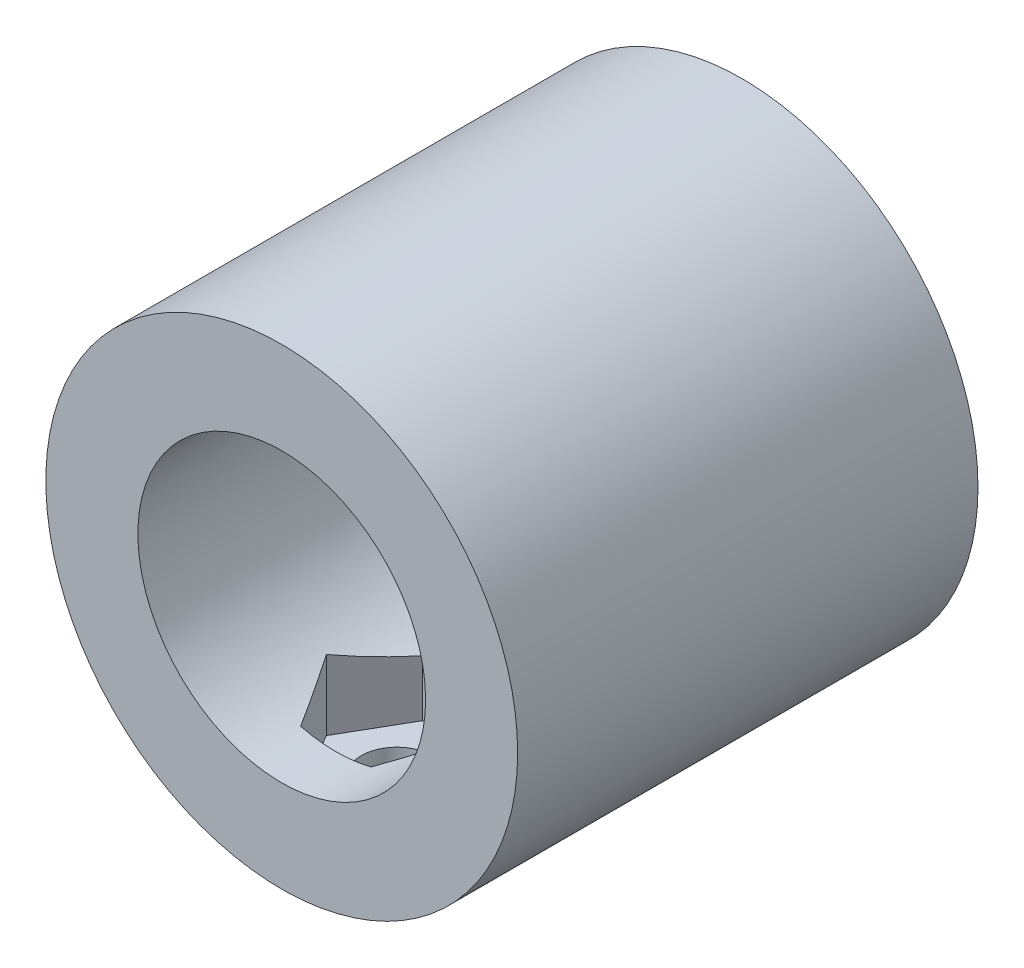
ISO-10303-21;
HEADER;
FILE_DESCRIPTION(('STEP AP214'),'2;1');
FILE_NAME('part.step','',(''),(''),'','','');
FILE_SCHEMA(('AUTOMOTIVE_DESIGN { 1 0 10303 214 1 1 1 1 }'));
ENDSEC;
DATA;
#1=APPLICATION_CONTEXT('core data for automotive mechanical design processes');
#2=APPLICATION_PROTOCOL_DEFINITION('international standard','automotive_design',2000,#1);
#3=PRODUCT_CONTEXT('',#1,'mechanical');
#4=PRODUCT('Part','Part','',(#3));
#5=PRODUCT_RELATED_PRODUCT_CATEGORY('part','',(#4));
#6=PRODUCT_DEFINITION_FORMATION('','',#4);
#7=PRODUCT_DEFINITION_CONTEXT('part definition',#1,'design');
#8=PRODUCT_DEFINITION('design','',#6,#7);
#9=PRODUCT_DEFINITION_SHAPE('','',#8);
#10=(LENGTH_UNIT() NAMED_UNIT(*) SI_UNIT(.MILLI.,.METRE.));
#11=(NAMED_UNIT(*) PLANE_ANGLE_UNIT() SI_UNIT($,.RADIAN.));
#12=(NAMED_UNIT(*) SI_UNIT($,.STERADIAN.) SOLID_ANGLE_UNIT());
#13=UNCERTAINTY_MEASURE_WITH_UNIT(LENGTH_MEASURE(1.E-05),#10,'distance_accuracy_value','');
#14=(GEOMETRIC_REPRESENTATION_CONTEXT(3) GLOBAL_UNCERTAINTY_ASSIGNED_CONTEXT((#13)) GLOBAL_UNIT_ASSIGNED_CONTEXT((#10,
#11,#12)) REPRESENTATION_CONTEXT('',''));
#15=CARTESIAN_POINT('',(0.,0.,0.));
#16=DIRECTION('',(0.,0.,1.));
#17=DIRECTION('',(1.,0.,0.));
#18=AXIS2_PLACEMENT_3D('',#15,#16,#17);
#19=CARTESIAN_POINT('',(0.,0.,-10.));
#20=DIRECTION('',(0.,0.,1.));
#21=DIRECTION('',(1.,0.,0.));
#22=AXIS2_PLACEMENT_3D('',#19,#20,#21);
#23=CYLINDRICAL_SURFACE('',#22,10.25);
#24=CARTESIAN_POINT('',(0.,-10.25,-3.45));
#25=CARTESIAN_POINT('',(-0.0865348321088135,-10.2499986053705,-3.45000356217303));
#26=CARTESIAN_POINT('',(-0.173119668117051,-10.2488926749848,-3.45727118533907));
#27=CARTESIAN_POINT('',(-0.343868589294295,-10.2445873413368,-3.48614196608053));
#28=CARTESIAN_POINT('',(-0.428030243864392,-10.2413859076363,-3.50775902783456));
#29=CARTESIAN_POINT('',(-0.591437063532486,-10.2332492883849,-3.56466750308635));
#30=CARTESIAN_POINT('',(-0.670685913026276,-10.2283154210548,-3.59994852167929));
#31=CARTESIAN_POINT('',(-0.822126594947794,-10.2172589365896,-3.68315788164029));
#32=CARTESIAN_POINT('',(-0.894319393482853,-10.2111364825382,-3.73108448825352));
#33=CARTESIAN_POINT('',(-1.03018345274116,-10.1983291923282,-3.83862969248016));
#34=CARTESIAN_POINT('',(-1.09379061702723,-10.1916406741666,-3.89832883451123));
#35=CARTESIAN_POINT('',(-1.21012477662503,-10.1784838680654,-4.02755114510604));
#36=CARTESIAN_POINT('',(-1.26285114202978,-10.1720155928941,-4.09707488203908));
#37=CARTESIAN_POINT('',(-1.35617702330486,-10.1599959063989,-4.24440419530083));
#38=CARTESIAN_POINT('',(-1.39671442797166,-10.1544492534188,-4.32224953792157));
#39=CARTESIAN_POINT('',(-1.46411473309154,-10.1449511446445,-4.48374187277448));
#40=CARTESIAN_POINT('',(-1.49097839113477,-10.1409996004761,-4.56738854329384));
#41=CARTESIAN_POINT('',(-1.53006937962636,-10.1351753427462,-4.73743463638538));
#42=CARTESIAN_POINT('',(-1.54240650911907,-10.1332870420529,-4.82380827419157));
#43=CARTESIAN_POINT('',(-1.55243440168558,-10.1317557596738,-4.99741886179157));
#44=CARTESIAN_POINT('',(-1.55012601926012,-10.1321126469912,-5.0846557609214));
#45=CARTESIAN_POINT('',(-1.5310181238825,-10.1350171653338,-5.25674033130877));
#46=CARTESIAN_POINT('',(-1.51434097371829,-10.1375462972047,-5.34160194670944));
#47=CARTESIAN_POINT('',(-1.46716052625552,-10.1444814322318,-5.50730841704655));
#48=CARTESIAN_POINT('',(-1.43665683198903,-10.1488874892753,-5.58815315658224));
#49=CARTESIAN_POINT('',(-1.36256214307549,-10.1591004242303,-5.74390286737503));
#50=CARTESIAN_POINT('',(-1.31891939003739,-10.1649128240033,-5.81878283873189));
#51=CARTESIAN_POINT('',(-1.2198222944323,-10.1772795520351,-5.96020301272271));
#52=CARTESIAN_POINT('',(-1.16436716418293,-10.1838339297576,-6.02674265873019));
#53=CARTESIAN_POINT('',(-1.04254816148594,-10.1970278025317,-6.15030247247038));
#54=CARTESIAN_POINT('',(-0.976079100793151,-10.2036674854031,-6.20721896499593));
#55=CARTESIAN_POINT('',(-0.834477366796303,-10.2162219677859,-6.30910479749397));
#56=CARTESIAN_POINT('',(-0.759344654427407,-10.2221367640285,-6.35407408359291));
#57=CARTESIAN_POINT('',(-0.60245796212873,-10.23258136228,-6.43079460909469));
#58=CARTESIAN_POINT('',(-0.52069997098957,-10.2371103172003,-6.46253776836357));
#59=CARTESIAN_POINT('',(-0.352929878355662,-10.2442658789525,-6.5118144109354));
#60=CARTESIAN_POINT('',(-0.26691806963106,-10.2468926165108,-6.52934887071587));
#61=CARTESIAN_POINT('',(-0.0939766088141966,-10.2499304485547,-6.54957232768525));
#62=CARTESIAN_POINT('',(-0.00706398241373882,-10.2503628125253,-6.55240384287632));
#63=CARTESIAN_POINT('',(0.165994899168943,-10.2490211041617,-6.5435194384284));
#64=CARTESIAN_POINT('',(0.252141178389057,-10.2472471012816,-6.5318039767141));
#65=CARTESIAN_POINT('',(0.420789704617876,-10.2417051449883,-6.49427668964021));
#66=CARTESIAN_POINT('',(0.503307770287664,-10.2379470270023,-6.46853437655401));
#67=CARTESIAN_POINT('',(0.662856674334904,-10.2288568390174,-6.40375747633752));
#68=CARTESIAN_POINT('',(0.739887251177548,-10.2235246940623,-6.36472225617644));
#69=CARTESIAN_POINT('',(0.886900712724522,-10.2118260815247,-6.27413380757472));
#70=CARTESIAN_POINT('',(0.956827354853739,-10.2054522669457,-6.22249027093183));
#71=CARTESIAN_POINT('',(1.08707208504692,-10.1924024017133,-6.10827678728586));
#72=CARTESIAN_POINT('',(1.14738960466405,-10.1857263332094,-6.0457061943296));
#73=CARTESIAN_POINT('',(1.25722314870822,-10.172756858438,-5.91077994903495));
#74=CARTESIAN_POINT('',(1.30664358383511,-10.166467162767,-5.8383460733735));
#75=CARTESIAN_POINT('',(1.3926154419135,-10.1550485464386,-5.68612128014781));
#76=CARTESIAN_POINT('',(1.42916721700988,-10.1499195940195,-5.6063305639755));
#77=CARTESIAN_POINT('',(1.48821639543038,-10.1414301103392,-5.44194085143561));
#78=CARTESIAN_POINT('',(1.51076391124777,-10.1380632804302,-5.35736019524326));
#79=CARTESIAN_POINT('',(1.54132390134593,-10.1334625625274,-5.18555783206999));
#80=CARTESIAN_POINT('',(1.549337397238,-10.1322285246179,-5.09833631115639));
#81=CARTESIAN_POINT('',(1.55057727658034,-10.1320387711031,-4.92468100595166));
#82=CARTESIAN_POINT('',(1.54395396996473,-10.1330598964486,-4.83824828268147));
#83=CARTESIAN_POINT('',(1.51643056540358,-10.1372150525975,-4.66774109427393));
#84=CARTESIAN_POINT('',(1.49553049184221,-10.1403490797922,-4.58366662510903));
#85=CARTESIAN_POINT('',(1.44010029519621,-10.1483687676275,-4.42030532027696));
#86=CARTESIAN_POINT('',(1.4055808489965,-10.1532530558792,-4.34101479025187));
#87=CARTESIAN_POINT('',(1.32390677752962,-10.1642245756178,-4.18932630486426));
#88=CARTESIAN_POINT('',(1.27675171036037,-10.1703118491745,-4.11692859068231));
#89=CARTESIAN_POINT('',(1.17059953896318,-10.1830778433865,-3.98031746522321));
#90=CARTESIAN_POINT('',(1.11149116104393,-10.18976176481,-3.91619099379086));
#91=CARTESIAN_POINT('',(0.983345389707575,-10.2029246649288,-3.79871386033702));
#92=CARTESIAN_POINT('',(0.914305692970891,-10.2094035956554,-3.74536570499539));
#93=CARTESIAN_POINT('',(0.76780194758175,-10.2214679961972,-3.65069225533131));
#94=CARTESIAN_POINT('',(0.690292896422896,-10.2270482605605,-3.6094359475474));
#95=CARTESIAN_POINT('',(0.529397254428289,-10.2366355718388,-3.54058932264131));
#96=CARTESIAN_POINT('',(0.446016836955974,-10.2406442428873,-3.51298488948904));
#97=CARTESIAN_POINT('',(0.301888233137365,-10.2457244681152,-3.47846909601471));
#98=CARTESIAN_POINT('',(0.242028502484471,-10.2473195347582,-3.46780955522207));
#99=CARTESIAN_POINT('',(0.121454052471653,-10.2494577834537,-3.45357380215324));
#100=CARTESIAN_POINT('',(0.0607393440078185,-10.2500009788992,-3.4499974996883));
#101=CARTESIAN_POINT('',(0.,-10.25,-3.45));
#102=B_SPLINE_CURVE_WITH_KNOTS('',3,(#24,#25,#26,#27,#28,#29,#30,#31,#32,#33,#34,#35,#36,#37,
#38,#39,#40,#41,#42,#43,#44,#45,#46,#47,#48,#49,#50,#51,#52,#53,#54,#55,#56,#57,#58,#59,#60,#61,
#62,#63,#64,#65,#66,#67,#68,#69,#70,#71,#72,#73,#74,#75,#76,#77,#78,#79,#80,#81,#82,#83,#84,#85,
#86,#87,#88,#89,#90,#91,#92,#93,#94,#95,#96,#97,#98,#99,#100,#101),.UNSPECIFIED.,.T.,.F.,(4,2,2,
2,2,2,2,2,2,2,2,2,2,2,2,2,2,2,2,2,2,2,2,2,2,2,2,2,2,2,2,2,2,2,2,2,2,2,4),(0.,0.259382543158152,
0.519016787871818,0.778453901650569,1.03785544365511,1.29909749425536,1.56035466433869,
1.82292139862237,2.08547358388471,2.34602825777858,2.6065677296013,2.86491016310354,
3.12326001423347,3.38264119790388,3.64203968325554,3.90407577382953,4.16611304598345,
4.42831016862053,4.69048927051505,4.95012221963153,5.20974699596226,5.46809670972895,
5.72645872826801,5.98672856906625,6.2470138009339,6.50949865976874,6.77197633526961,
7.03350927259408,7.29502382578523,7.55386529533026,7.81270632278487,8.07134483415255,
8.32999239199401,8.59116878573633,8.85240585072738,9.11510554352298,9.37753303409524,
9.55959759397974,9.74165983567561),.UNSPECIFIED.);
#103=CARTESIAN_POINT('',(0.,-10.25,-3.45));
#104=VERTEX_POINT('',#103);
#105=EDGE_CURVE('E152',#104,#104,#102,.T.);
#106=ORIENTED_EDGE('',*,*,#105,.F.);
#107=EDGE_LOOP('',(#106));
#108=FACE_BOUND('',#107,.T.);
#109=CARTESIAN_POINT('',(0.,-10.25,6.55));
#110=CARTESIAN_POINT('',(-0.0865348321088134,-10.2499986053705,6.54999643782697));
#111=CARTESIAN_POINT('',(-0.17311966811705,-10.2488926749848,6.54272881466093));
#112=CARTESIAN_POINT('',(-0.343868589294295,-10.2445873413368,6.51385803391947));
#113=CARTESIAN_POINT('',(-0.428030243864392,-10.2413859076363,6.49224097216544));
#114=CARTESIAN_POINT('',(-0.591437063532485,-10.2332492883849,6.43533249691365));
#115=CARTESIAN_POINT('',(-0.670685913026275,-10.2283154210548,6.40005147832071));
#116=CARTESIAN_POINT('',(-0.822126594947793,-10.2172589365896,6.31684211835971));
#117=CARTESIAN_POINT('',(-0.894319393482852,-10.2111364825382,6.26891551174648));
#118=CARTESIAN_POINT('',(-1.03018345274116,-10.1983291923282,6.16137030751984));
#119=CARTESIAN_POINT('',(-1.09379061702723,-10.1916406741666,6.10167116548877));
#120=CARTESIAN_POINT('',(-1.21012477662503,-10.1784838680654,5.97244885489396));
#121=CARTESIAN_POINT('',(-1.26285114202978,-10.1720155928941,5.90292511796092));
#122=CARTESIAN_POINT('',(-1.35617702330486,-10.1599959063989,5.75559580469918));
#123=CARTESIAN_POINT('',(-1.39671442797166,-10.1544492534188,5.67775046207843));
#124=CARTESIAN_POINT('',(-1.46411473309154,-10.1449511446445,5.51625812722552));
#125=CARTESIAN_POINT('',(-1.49097839113477,-10.1409996004761,5.43261145670616));
#126=CARTESIAN_POINT('',(-1.53006937962636,-10.1351753427462,5.26256536361462));
#127=CARTESIAN_POINT('',(-1.54240650911907,-10.1332870420529,5.17619172580843));
#128=CARTESIAN_POINT('',(-1.55243440168558,-10.1317557596738,5.00258113820843));
#129=CARTESIAN_POINT('',(-1.55012601926012,-10.1321126469912,4.9153442390786));
#130=CARTESIAN_POINT('',(-1.5310181238825,-10.1350171653338,4.74325966869123));
#131=CARTESIAN_POINT('',(-1.51434097371829,-10.1375462972047,4.65839805329056));
#132=CARTESIAN_POINT('',(-1.46716052625552,-10.1444814322318,4.49269158295345));
#133=CARTESIAN_POINT('',(-1.43665683198903,-10.1488874892753,4.41184684341776));
#134=CARTESIAN_POINT('',(-1.36256214307549,-10.1591004242303,4.25609713262497));
#135=CARTESIAN_POINT('',(-1.31891939003739,-10.1649128240033,4.18121716126811));
#136=CARTESIAN_POINT('',(-1.2198222944323,-10.1772795520351,4.03979698727729));
#137=CARTESIAN_POINT('',(-1.16436716418293,-10.1838339297576,3.97325734126981));
#138=CARTESIAN_POINT('',(-1.04254816148594,-10.1970278025317,3.84969752752962));
#139=CARTESIAN_POINT('',(-0.976079100793151,-10.2036674854031,3.79278103500408));
#140=CARTESIAN_POINT('',(-0.834477366796303,-10.2162219677859,3.69089520250603));
#141=CARTESIAN_POINT('',(-0.759344654427407,-10.2221367640285,3.64592591640709));
#142=CARTESIAN_POINT('',(-0.60245796212873,-10.23258136228,3.56920539090531));
#143=CARTESIAN_POINT('',(-0.52069997098957,-10.2371103172003,3.53746223163643));
#144=CARTESIAN_POINT('',(-0.352929878355663,-10.2442658789525,3.4881855890646));
#145=CARTESIAN_POINT('',(-0.266918069631061,-10.2468926165108,3.47065112928413));
#146=CARTESIAN_POINT('',(-0.0939766088141973,-10.2499304485547,3.45042767231475));
#147=CARTESIAN_POINT('',(-0.00706398241373914,-10.2503628125253,3.44759615712368));
#148=CARTESIAN_POINT('',(0.165994899168943,-10.2490211041617,3.4564805615716));
#149=CARTESIAN_POINT('',(0.252141178389056,-10.2472471012816,3.4681960232859));
#150=CARTESIAN_POINT('',(0.420789704617876,-10.2417051449883,3.50572331035979));
#151=CARTESIAN_POINT('',(0.503307770287664,-10.2379470270023,3.53146562344599));
#152=CARTESIAN_POINT('',(0.662856674334904,-10.2288568390174,3.59624252366248));
#153=CARTESIAN_POINT('',(0.739887251177547,-10.2235246940623,3.63527774382356));
#154=CARTESIAN_POINT('',(0.886900712724522,-10.2118260815247,3.72586619242528));
#155=CARTESIAN_POINT('',(0.956827354853738,-10.2054522669457,3.77750972906817));
#156=CARTESIAN_POINT('',(1.08707208504692,-10.1924024017133,3.89172321271414));
#157=CARTESIAN_POINT('',(1.14738960466405,-10.1857263332094,3.9542938056704));
#158=CARTESIAN_POINT('',(1.25722314870822,-10.172756858438,4.08922005096504));
#159=CARTESIAN_POINT('',(1.30664358383511,-10.166467162767,4.1616539266265));
#160=CARTESIAN_POINT('',(1.3926154419135,-10.1550485464386,4.31387871985219));
#161=CARTESIAN_POINT('',(1.42916721700988,-10.1499195940195,4.3936694360245));
#162=CARTESIAN_POINT('',(1.48821639543038,-10.1414301103392,4.55805914856439));
#163=CARTESIAN_POINT('',(1.51076391124777,-10.1380632804302,4.64263980475674));
#164=CARTESIAN_POINT('',(1.54132390134593,-10.1334625625274,4.81444216793001));
#165=CARTESIAN_POINT('',(1.549337397238,-10.1322285246179,4.90166368884361));
#166=CARTESIAN_POINT('',(1.55057727658034,-10.1320387711031,5.07531899404834));
#167=CARTESIAN_POINT('',(1.54395396996473,-10.1330598964486,5.16175171731853));
#168=CARTESIAN_POINT('',(1.51643056540358,-10.1372150525975,5.33225890572607));
#169=CARTESIAN_POINT('',(1.49553049184221,-10.1403490797922,5.41633337489097));
#170=CARTESIAN_POINT('',(1.44010029519621,-10.1483687676275,5.57969467972304));
#171=CARTESIAN_POINT('',(1.4055808489965,-10.1532530558792,5.65898520974813));
#172=CARTESIAN_POINT('',(1.32390677752962,-10.1642245756178,5.81067369513574));
#173=CARTESIAN_POINT('',(1.27675171036037,-10.1703118491745,5.88307140931769));
#174=CARTESIAN_POINT('',(1.17059953896318,-10.1830778433865,6.01968253477679));
#175=CARTESIAN_POINT('',(1.11149116104394,-10.18976176481,6.08380900620914));
#176=CARTESIAN_POINT('',(0.983345389707577,-10.2029246649288,6.20128613966298));
#177=CARTESIAN_POINT('',(0.914305692970891,-10.2094035956554,6.2546342950046));
#178=CARTESIAN_POINT('',(0.767801947581751,-10.2214679961972,6.34930774466869));
#179=CARTESIAN_POINT('',(0.690292896422897,-10.2270482605605,6.3905640524526));
#180=CARTESIAN_POINT('',(0.529397254428291,-10.2366355718388,6.45941067735869));
#181=CARTESIAN_POINT('',(0.446016836955975,-10.2406442428873,6.48701511051095));
#182=CARTESIAN_POINT('',(0.301888233137366,-10.2457244681152,6.52153090398529));
#183=CARTESIAN_POINT('',(0.242028502484471,-10.2473195347582,6.53219044477793));
#184=CARTESIAN_POINT('',(0.121454052471652,-10.2494577834537,6.54642619784676));
#185=CARTESIAN_POINT('',(0.0607393440078182,-10.2500009788992,6.5500025003117));
#186=CARTESIAN_POINT('',(0.,-10.25,6.55));
#187=B_SPLINE_CURVE_WITH_KNOTS('',3,(#109,#110,#111,#112,#113,#114,#115,#116,#117,#118,#119,
#120,#121,#122,#123,#124,#125,#126,#127,#128,#129,#130,#131,#132,#133,#134,#135,#136,#137,#138,
#139,#140,#141,#142,#143,#144,#145,#146,#147,#148,#149,#150,#151,#152,#153,#154,#155,#156,#157,
#158,#159,#160,#161,#162,#163,#164,#165,#166,#167,#168,#169,#170,#171,#172,#173,#174,#175,#176,
#177,#178,#179,#180,#181,#182,#183,#184,#185,#186),.UNSPECIFIED.,.T.,.F.,(4,2,2,2,2,2,2,2,2,2,2,
2,2,2,2,2,2,2,2,2,2,2,2,2,2,2,2,2,2,2,2,2,2,2,2,2,2,2,4),(0.,0.259382543158152,
0.519016787871818,0.778453901650568,1.03785544365511,1.29909749425536,1.56035466433869,
1.82292139862237,2.08547358388471,2.34602825777858,2.6065677296013,2.86491016310354,
3.12326001423347,3.38264119790388,3.64203968325554,3.90407577382953,4.16611304598345,
4.42831016862053,4.69048927051505,4.95012221963153,5.20974699596226,5.46809670972895,
5.72645872826801,5.98672856906625,6.2470138009339,6.50949865976874,6.77197633526961,
7.03350927259408,7.29502382578523,7.55386529533026,7.81270632278487,8.07134483415255,
8.32999239199401,8.59116878573632,8.85240585072738,9.11510554352298,9.37753303409524,
9.55959759397974,9.7416598356756),.UNSPECIFIED.);
#188=CARTESIAN_POINT('',(0.,-10.25,6.55));
#189=VERTEX_POINT('',#188);
#190=EDGE_CURVE('E283',#189,#189,#187,.T.);
#191=ORIENTED_EDGE('',*,*,#190,.F.);
#192=EDGE_LOOP('',(#191));
#193=FACE_BOUND('',#192,.T.);
#194=CARTESIAN_POINT('',(0.,0.,-10.));
#195=DIRECTION('',(0.,0.,1.));
#196=DIRECTION('',(1.,0.,0.));
#197=AXIS2_PLACEMENT_3D('',#194,#195,#196);
#198=CIRCLE('',#197,10.25);
#199=CARTESIAN_POINT('',(10.25,0.,-10.));
#200=VERTEX_POINT('',#199);
#201=EDGE_CURVE('E217',#200,#200,#198,.T.);
#202=ORIENTED_EDGE('',*,*,#201,.T.);
#203=EDGE_LOOP('',(#202));
#204=FACE_BOUND('',#203,.T.);
#205=CARTESIAN_POINT('',(0.,0.,10.));
#206=DIRECTION('',(0.,0.,1.));
#207=DIRECTION('',(1.,0.,0.));
#208=AXIS2_PLACEMENT_3D('',#205,#206,#207);
#209=CIRCLE('',#208,10.25);
#210=CARTESIAN_POINT('',(10.25,0.,10.));
#211=VERTEX_POINT('',#210);
#212=EDGE_CURVE('E211',#211,#211,#209,.T.);
#213=ORIENTED_EDGE('',*,*,#212,.F.);
#214=EDGE_LOOP('',(#213));
#215=FACE_BOUND('',#214,.T.);
#216=ADVANCED_FACE('F37',(#108,#193,#204,#215),#23,.T.);
#217=CARTESIAN_POINT('',(0.,0.,-10.));
#218=DIRECTION('',(0.,0.,1.));
#219=DIRECTION('',(1.,0.,0.));
#220=AXIS2_PLACEMENT_3D('',#217,#218,#219);
#221=PLANE('',#220);
#222=CARTESIAN_POINT('',(0.,0.,-10.));
#223=DIRECTION('',(0.,0.,1.));
#224=DIRECTION('',(1.,0.,0.));
#225=AXIS2_PLACEMENT_3D('',#222,#223,#224);
#226=CIRCLE('',#225,6.25);
#227=CARTESIAN_POINT('',(6.25,0.,-10.));
#228=VERTEX_POINT('',#227);
#229=EDGE_CURVE('E214',#228,#228,#226,.T.);
#230=ORIENTED_EDGE('',*,*,#229,.T.);
#231=EDGE_LOOP('',(#230));
#232=FACE_BOUND('',#231,.T.);
#233=ORIENTED_EDGE('',*,*,#201,.F.);
#234=EDGE_LOOP('',(#233));
#235=FACE_BOUND('',#234,.T.);
#236=ADVANCED_FACE('F271',(#232,#235),#221,.F.);
#237=CARTESIAN_POINT('',(0.,0.,-10.));
#238=DIRECTION('',(0.,0.,1.));
#239=DIRECTION('',(1.,0.,0.));
#240=AXIS2_PLACEMENT_3D('',#237,#238,#239);
#241=CYLINDRICAL_SURFACE('',#240,6.25);
#242=CARTESIAN_POINT('',(0.,0.,2.35));
#243=DIRECTION('',(0.,0.,-1.));
#244=DIRECTION('',(-1.,0.,0.));
#245=AXIS2_PLACEMENT_3D('',#242,#243,#244);
#246=CIRCLE('',#245,6.25);
#247=CARTESIAN_POINT('',(-1.52997821335251,-6.0598404819489,2.35));
#248=VERTEX_POINT('',#247);
#249=CARTESIAN_POINT('',(1.52997821335251,-6.0598404819489,2.35));
#250=VERTEX_POINT('',#249);
#251=EDGE_CURVE('E238',#248,#250,#246,.F.);
#252=ORIENTED_EDGE('',*,*,#251,.T.);
#253=CARTESIAN_POINT('',(0.,0.,-0.300000000000003));
#254=DIRECTION('',(0.866025403784439,0.,-0.5));
#255=DIRECTION('',(0.5,0.,0.866025403784439));
#256=AXIS2_PLACEMENT_3D('',#253,#254,#255);
#257=ELLIPSE('',#256,12.5,6.25);
#258=CARTESIAN_POINT('',(3.05995642670502,-5.44969418102215,5.));
#259=VERTEX_POINT('',#258);
#260=EDGE_CURVE('E11',#250,#259,#257,.F.);
#261=ORIENTED_EDGE('',*,*,#260,.T.);
#262=CARTESIAN_POINT('',(0.,0.,10.3));
#263=DIRECTION('',(0.866025403784439,0.,0.5));
#264=DIRECTION('',(-0.5,0.,0.866025403784439));
#265=AXIS2_PLACEMENT_3D('',#262,#263,#264);
#266=ELLIPSE('',#265,12.5,6.25);
#267=CARTESIAN_POINT('',(1.52997821335251,-6.0598404819489,7.65));
#268=VERTEX_POINT('',#267);
#269=EDGE_CURVE('E45',#259,#268,#266,.F.);
#270=ORIENTED_EDGE('',*,*,#269,.T.);
#271=CARTESIAN_POINT('',(0.,0.,7.65));
#272=DIRECTION('',(0.,0.,1.));
#273=DIRECTION('',(1.,0.,0.));
#274=AXIS2_PLACEMENT_3D('',#271,#272,#273);
#275=CIRCLE('',#274,6.25);
#276=CARTESIAN_POINT('',(-1.52997821335251,-6.0598404819489,7.65));
#277=VERTEX_POINT('',#276);
#278=EDGE_CURVE('E246',#268,#277,#275,.F.);
#279=ORIENTED_EDGE('',*,*,#278,.T.);
#280=CARTESIAN_POINT('',(0.,0.,10.3));
#281=DIRECTION('',(-0.866025403784439,0.,0.5));
#282=DIRECTION('',(0.5,0.,0.866025403784439));
#283=AXIS2_PLACEMENT_3D('',#280,#281,#282);
#284=ELLIPSE('',#283,12.5,6.25);
#285=CARTESIAN_POINT('',(-3.05995642670502,-5.44969418102215,5.));
#286=VERTEX_POINT('',#285);
#287=EDGE_CURVE('E243',#277,#286,#284,.F.);
#288=ORIENTED_EDGE('',*,*,#287,.T.);
#289=CARTESIAN_POINT('',(0.,0.,-0.300000000000007));
#290=DIRECTION('',(-0.866025403784439,0.,-0.5));
#291=DIRECTION('',(-0.5,0.,0.866025403784439));
#292=AXIS2_PLACEMENT_3D('',#289,#290,#291);
#293=ELLIPSE('',#292,12.5,6.25);
#294=EDGE_CURVE('E240',#286,#248,#293,.F.);
#295=ORIENTED_EDGE('',*,*,#294,.T.);
#296=EDGE_LOOP('',(#252,#261,#270,#279,#288,#295));
#297=FACE_BOUND('',#296,.T.);
#298=CARTESIAN_POINT('',(0.,0.,-7.65));
#299=DIRECTION('',(0.,0.,-1.));
#300=DIRECTION('',(-1.,0.,0.));
#301=AXIS2_PLACEMENT_3D('',#298,#299,#300);
#302=CIRCLE('',#301,6.25);
#303=CARTESIAN_POINT('',(-1.52997821335251,-6.0598404819489,-7.65));
#304=VERTEX_POINT('',#303);
#305=CARTESIAN_POINT('',(1.52997821335251,-6.0598404819489,-7.65));
#306=VERTEX_POINT('',#305);
#307=EDGE_CURVE('E220',#304,#306,#302,.F.);
#308=ORIENTED_EDGE('',*,*,#307,.T.);
#309=CARTESIAN_POINT('',(0.,0.,-10.3));
#310=DIRECTION('',(0.866025403784439,0.,-0.5));
#311=DIRECTION('',(0.5,0.,0.866025403784439));
#312=AXIS2_PLACEMENT_3D('',#309,#310,#311);
#313=ELLIPSE('',#312,12.5,6.25);
#314=CARTESIAN_POINT('',(3.05995642670502,-5.44969418102215,-5.));
#315=VERTEX_POINT('',#314);
#316=EDGE_CURVE('E235',#306,#315,#313,.F.);
#317=ORIENTED_EDGE('',*,*,#316,.T.);
#318=CARTESIAN_POINT('',(0.,0.,0.300000000000003));
#319=DIRECTION('',(0.866025403784439,0.,0.5));
#320=DIRECTION('',(-0.5,0.,0.866025403784439));
#321=AXIS2_PLACEMENT_3D('',#318,#319,#320);
#322=ELLIPSE('',#321,12.5,6.25);
#323=CARTESIAN_POINT('',(1.52997821335251,-6.0598404819489,-2.35));
#324=VERTEX_POINT('',#323);
#325=EDGE_CURVE('E232',#315,#324,#322,.F.);
#326=ORIENTED_EDGE('',*,*,#325,.T.);
#327=CARTESIAN_POINT('',(0.,0.,-2.35));
#328=DIRECTION('',(0.,0.,1.));
#329=DIRECTION('',(1.,0.,0.));
#330=AXIS2_PLACEMENT_3D('',#327,#328,#329);
#331=CIRCLE('',#330,6.25);
#332=CARTESIAN_POINT('',(-1.52997821335251,-6.0598404819489,-2.35));
#333=VERTEX_POINT('',#332);
#334=EDGE_CURVE('E229',#324,#333,#331,.F.);
#335=ORIENTED_EDGE('',*,*,#334,.T.);
#336=CARTESIAN_POINT('',(0.,0.,0.300000000000007));
#337=DIRECTION('',(-0.866025403784439,0.,0.5));
#338=DIRECTION('',(0.5,0.,0.866025403784439));
#339=AXIS2_PLACEMENT_3D('',#336,#337,#338);
#340=ELLIPSE('',#339,12.5,6.25);
#341=CARTESIAN_POINT('',(-3.05995642670502,-5.44969418102215,-5.));
#342=VERTEX_POINT('',#341);
#343=EDGE_CURVE('E226',#333,#342,#340,.F.);
#344=ORIENTED_EDGE('',*,*,#343,.T.);
#345=CARTESIAN_POINT('',(0.,0.,-10.3));
#346=DIRECTION('',(-0.866025403784439,0.,-0.5));
#347=DIRECTION('',(-0.5,0.,0.866025403784439));
#348=AXIS2_PLACEMENT_3D('',#345,#346,#347);
#349=ELLIPSE('',#348,12.5,6.25);
#350=EDGE_CURVE('E223',#342,#304,#349,.F.);
#351=ORIENTED_EDGE('',*,*,#350,.T.);
#352=EDGE_LOOP('',(#308,#317,#326,#335,#344,#351));
#353=FACE_BOUND('',#352,.T.);
#354=ORIENTED_EDGE('',*,*,#229,.F.);
#355=EDGE_LOOP('',(#354));
#356=FACE_BOUND('',#355,.T.);
#357=CARTESIAN_POINT('',(0.,0.,10.));
#358=DIRECTION('',(0.,0.,1.));
#359=DIRECTION('',(1.,0.,0.));
#360=AXIS2_PLACEMENT_3D('',#357,#358,#359);
#361=CIRCLE('',#360,6.25);
#362=CARTESIAN_POINT('',(6.25,0.,10.));
#363=VERTEX_POINT('',#362);
#364=EDGE_CURVE('E168',#363,#363,#361,.T.);
#365=ORIENTED_EDGE('',*,*,#364,.T.);
#366=EDGE_LOOP('',(#365));
#367=FACE_BOUND('',#366,.T.);
#368=ADVANCED_FACE('F250',(#297,#353,#356,#367),#241,.F.);
#369=CARTESIAN_POINT('',(0.,0.,10.));
#370=DIRECTION('',(0.,0.,1.));
#371=DIRECTION('',(1.,0.,0.));
#372=AXIS2_PLACEMENT_3D('',#369,#370,#371);
#373=PLANE('',#372);
#374=ORIENTED_EDGE('',*,*,#212,.T.);
#375=EDGE_LOOP('',(#374));
#376=FACE_BOUND('',#375,.T.);
#377=ORIENTED_EDGE('',*,*,#364,.F.);
#378=EDGE_LOOP('',(#377));
#379=FACE_BOUND('',#378,.T.);
#380=ADVANCED_FACE('F288',(#376,#379),#373,.T.);
#381=CARTESIAN_POINT('',(1.52997821335251,-8.5,-7.65));
#382=DIRECTION('',(0.866025403784439,0.,-0.5));
#383=DIRECTION('',(-0.5,0.,-0.866025403784439));
#384=AXIS2_PLACEMENT_3D('',#381,#382,#383);
#385=PLANE('',#384);
#386=DIRECTION('',(0.,1.,0.));
#387=VECTOR('',#386,1.);
#388=CARTESIAN_POINT('',(1.52997821335251,-8.5,-7.65));
#389=LINE('',#388,#387);
#390=CARTESIAN_POINT('',(1.52997821335251,-8.5,-7.65));
#391=VERTEX_POINT('',#390);
#392=EDGE_CURVE('E60',#391,#306,#389,.T.);
#393=ORIENTED_EDGE('',*,*,#392,.F.);
#394=DIRECTION('',(-0.5,0.,-0.866025403784439));
#395=VECTOR('',#394,1.);
#396=CARTESIAN_POINT('',(1.52997821335251,-8.5,-7.65));
#397=LINE('',#396,#395);
#398=CARTESIAN_POINT('',(3.05995642670502,-8.5,-5.));
#399=VERTEX_POINT('',#398);
#400=EDGE_CURVE('E179',#399,#391,#397,.T.);
#401=ORIENTED_EDGE('',*,*,#400,.F.);
#402=DIRECTION('',(0.,1.,0.));
#403=VECTOR('',#402,1.);
#404=CARTESIAN_POINT('',(3.05995642670502,-8.5,-5.));
#405=LINE('',#404,#403);
#406=EDGE_CURVE('E146',#399,#315,#405,.T.);
#407=ORIENTED_EDGE('',*,*,#406,.T.);
#408=ORIENTED_EDGE('',*,*,#316,.F.);
#409=EDGE_LOOP('',(#393,#401,#407,#408));
#410=FACE_BOUND('',#409,.T.);
#411=ADVANCED_FACE('F291',(#410),#385,.F.);
#412=CARTESIAN_POINT('',(3.05995642670502,-8.5,-5.));
#413=DIRECTION('',(0.866025403784439,0.,0.5));
#414=DIRECTION('',(0.5,0.,-0.866025403784439));
#415=AXIS2_PLACEMENT_3D('',#412,#413,#414);
#416=PLANE('',#415);
#417=ORIENTED_EDGE('',*,*,#406,.F.);
#418=DIRECTION('',(0.5,0.,-0.866025403784439));
#419=VECTOR('',#418,1.);
#420=CARTESIAN_POINT('',(3.05995642670502,-8.5,-5.));
#421=LINE('',#420,#419);
#422=CARTESIAN_POINT('',(1.52997821335251,-8.5,-2.35));
#423=VERTEX_POINT('',#422);
#424=EDGE_CURVE('E194',#423,#399,#421,.T.);
#425=ORIENTED_EDGE('',*,*,#424,.F.);
#426=DIRECTION('',(0.,1.,0.));
#427=VECTOR('',#426,1.);
#428=CARTESIAN_POINT('',(1.52997821335251,-8.5,-2.35));
#429=LINE('',#428,#427);
#430=EDGE_CURVE('E149',#423,#324,#429,.T.);
#431=ORIENTED_EDGE('',*,*,#430,.T.);
#432=ORIENTED_EDGE('',*,*,#325,.F.);
#433=EDGE_LOOP('',(#417,#425,#431,#432));
#434=FACE_BOUND('',#433,.T.);
#435=ADVANCED_FACE('F302',(#434),#416,.F.);
#436=CARTESIAN_POINT('',(1.52997821335251,-8.5,-2.35));
#437=DIRECTION('',(0.,0.,1.));
#438=DIRECTION('',(1.,0.,0.));
#439=AXIS2_PLACEMENT_3D('',#436,#437,#438);
#440=PLANE('',#439);
#441=ORIENTED_EDGE('',*,*,#430,.F.);
#442=DIRECTION('',(1.,0.,0.));
#443=VECTOR('',#442,1.);
#444=CARTESIAN_POINT('',(1.52997821335251,-8.5,-2.35));
#445=LINE('',#444,#443);
#446=CARTESIAN_POINT('',(-1.52997821335251,-8.5,-2.35));
#447=VERTEX_POINT('',#446);
#448=EDGE_CURVE('E191',#447,#423,#445,.T.);
#449=ORIENTED_EDGE('',*,*,#448,.F.);
#450=DIRECTION('',(0.,1.,0.));
#451=VECTOR('',#450,1.);
#452=CARTESIAN_POINT('',(-1.52997821335251,-8.5,-2.35));
#453=LINE('',#452,#451);
#454=EDGE_CURVE('E199',#447,#333,#453,.T.);
#455=ORIENTED_EDGE('',*,*,#454,.T.);
#456=ORIENTED_EDGE('',*,*,#334,.F.);
#457=EDGE_LOOP('',(#441,#449,#455,#456));
#458=FACE_BOUND('',#457,.T.);
#459=ADVANCED_FACE('F315',(#458),#440,.F.);
#460=CARTESIAN_POINT('',(-1.52997821335251,-8.5,-2.35));
#461=DIRECTION('',(-0.866025403784439,0.,0.5));
#462=DIRECTION('',(0.5,0.,0.866025403784439));
#463=AXIS2_PLACEMENT_3D('',#460,#461,#462);
#464=PLANE('',#463);
#465=ORIENTED_EDGE('',*,*,#454,.F.);
#466=DIRECTION('',(0.5,0.,0.866025403784439));
#467=VECTOR('',#466,1.);
#468=CARTESIAN_POINT('',(-1.52997821335251,-8.5,-2.35));
#469=LINE('',#468,#467);
#470=CARTESIAN_POINT('',(-3.05995642670502,-8.5,-5.));
#471=VERTEX_POINT('',#470);
#472=EDGE_CURVE('E188',#471,#447,#469,.T.);
#473=ORIENTED_EDGE('',*,*,#472,.F.);
#474=DIRECTION('',(0.,1.,0.));
#475=VECTOR('',#474,1.);
#476=CARTESIAN_POINT('',(-3.05995642670502,-8.5,-5.));
#477=LINE('',#476,#475);
#478=EDGE_CURVE('E202',#471,#342,#477,.T.);
#479=ORIENTED_EDGE('',*,*,#478,.T.);
#480=ORIENTED_EDGE('',*,*,#343,.F.);
#481=EDGE_LOOP('',(#465,#473,#479,#480));
#482=FACE_BOUND('',#481,.T.);
#483=ADVANCED_FACE('F311',(#482),#464,.F.);
#484=CARTESIAN_POINT('',(-3.05995642670502,-8.5,-5.));
#485=DIRECTION('',(-0.866025403784439,0.,-0.5));
#486=DIRECTION('',(-0.5,0.,0.866025403784439));
#487=AXIS2_PLACEMENT_3D('',#484,#485,#486);
#488=PLANE('',#487);
#489=ORIENTED_EDGE('',*,*,#478,.F.);
#490=DIRECTION('',(-0.5,0.,0.866025403784439));
#491=VECTOR('',#490,1.);
#492=CARTESIAN_POINT('',(-3.05995642670502,-8.5,-5.));
#493=LINE('',#492,#491);
#494=CARTESIAN_POINT('',(-1.52997821335251,-8.5,-7.65));
#495=VERTEX_POINT('',#494);
#496=EDGE_CURVE('E185',#495,#471,#493,.T.);
#497=ORIENTED_EDGE('',*,*,#496,.F.);
#498=DIRECTION('',(0.,1.,0.));
#499=VECTOR('',#498,1.);
#500=CARTESIAN_POINT('',(-1.52997821335251,-8.5,-7.65));
#501=LINE('',#500,#499);
#502=EDGE_CURVE('E205',#495,#304,#501,.T.);
#503=ORIENTED_EDGE('',*,*,#502,.T.);
#504=ORIENTED_EDGE('',*,*,#350,.F.);
#505=EDGE_LOOP('',(#489,#497,#503,#504));
#506=FACE_BOUND('',#505,.T.);
#507=ADVANCED_FACE('F308',(#506),#488,.F.);
#508=CARTESIAN_POINT('',(-1.52997821335251,-8.5,-7.65));
#509=DIRECTION('',(0.,0.,-1.));
#510=DIRECTION('',(-1.,0.,0.));
#511=AXIS2_PLACEMENT_3D('',#508,#509,#510);
#512=PLANE('',#511);
#513=ORIENTED_EDGE('',*,*,#502,.F.);
#514=DIRECTION('',(-1.,0.,0.));
#515=VECTOR('',#514,1.);
#516=CARTESIAN_POINT('',(-1.52997821335251,-8.5,-7.65));
#517=LINE('',#516,#515);
#518=EDGE_CURVE('E182',#391,#495,#517,.T.);
#519=ORIENTED_EDGE('',*,*,#518,.F.);
#520=ORIENTED_EDGE('',*,*,#392,.T.);
#521=ORIENTED_EDGE('',*,*,#307,.F.);
#522=EDGE_LOOP('',(#513,#519,#520,#521));
#523=FACE_BOUND('',#522,.T.);
#524=ADVANCED_FACE('F304',(#523),#512,.F.);
#525=CARTESIAN_POINT('',(0.,-8.5,0.));
#526=DIRECTION('',(0.,-1.,0.));
#527=DIRECTION('',(0.,0.,-1.));
#528=AXIS2_PLACEMENT_3D('',#525,#526,#527);
#529=PLANE('',#528);
#530=CARTESIAN_POINT('',(0.,-8.5,-5.));
#531=DIRECTION('',(0.,-1.,0.));
#532=DIRECTION('',(0.,0.,-1.));
#533=AXIS2_PLACEMENT_3D('',#530,#531,#532);
#534=CIRCLE('',#533,1.55);
#535=CARTESIAN_POINT('',(0.,-8.5,-6.55));
#536=VERTEX_POINT('',#535);
#537=EDGE_CURVE('E350',#536,#536,#534,.T.);
#538=ORIENTED_EDGE('',*,*,#537,.T.);
#539=EDGE_LOOP('',(#538));
#540=FACE_BOUND('',#539,.T.);
#541=ORIENTED_EDGE('',*,*,#400,.T.);
#542=ORIENTED_EDGE('',*,*,#518,.T.);
#543=ORIENTED_EDGE('',*,*,#496,.T.);
#544=ORIENTED_EDGE('',*,*,#472,.T.);
#545=ORIENTED_EDGE('',*,*,#448,.T.);
#546=ORIENTED_EDGE('',*,*,#424,.T.);
#547=EDGE_LOOP('',(#541,#542,#543,#544,#545,#546));
#548=FACE_BOUND('',#547,.T.);
#549=ADVANCED_FACE('F307',(#540,#548),#529,.F.);
#550=CARTESIAN_POINT('',(3.05995642670502,-8.5,5.));
#551=DIRECTION('',(0.866025403784439,0.,-0.5));
#552=DIRECTION('',(-0.5,0.,-0.866025403784439));
#553=AXIS2_PLACEMENT_3D('',#550,#551,#552);
#554=PLANE('',#553);
#555=DIRECTION('',(0.,1.,0.));
#556=VECTOR('',#555,1.);
#557=CARTESIAN_POINT('',(1.52997821335251,-8.5,2.35));
#558=LINE('',#557,#556);
#559=CARTESIAN_POINT('',(1.52997821335251,-8.5,2.35));
#560=VERTEX_POINT('',#559);
#561=EDGE_CURVE('E52',#560,#250,#558,.T.);
#562=ORIENTED_EDGE('',*,*,#561,.F.);
#563=DIRECTION('',(-0.5,0.,-0.866025403784439));
#564=VECTOR('',#563,1.);
#565=CARTESIAN_POINT('',(3.05995642670502,-8.5,5.));
#566=LINE('',#565,#564);
#567=CARTESIAN_POINT('',(3.05995642670502,-8.5,5.));
#568=VERTEX_POINT('',#567);
#569=EDGE_CURVE('E128',#568,#560,#566,.T.);
#570=ORIENTED_EDGE('',*,*,#569,.F.);
#571=DIRECTION('',(0.,1.,0.));
#572=VECTOR('',#571,1.);
#573=CARTESIAN_POINT('',(3.05995642670502,-8.5,5.));
#574=LINE('',#573,#572);
#575=EDGE_CURVE('E166',#568,#259,#574,.T.);
#576=ORIENTED_EDGE('',*,*,#575,.T.);
#577=ORIENTED_EDGE('',*,*,#260,.F.);
#578=EDGE_LOOP('',(#562,#570,#576,#577));
#579=FACE_BOUND('',#578,.T.);
#580=ADVANCED_FACE('F125',(#579),#554,.F.);
#581=CARTESIAN_POINT('',(1.52997821335251,-8.5,7.65));
#582=DIRECTION('',(0.866025403784439,0.,0.5));
#583=DIRECTION('',(0.5,0.,-0.866025403784439));
#584=AXIS2_PLACEMENT_3D('',#581,#582,#583);
#585=PLANE('',#584);
#586=ORIENTED_EDGE('',*,*,#575,.F.);
#587=DIRECTION('',(0.5,0.,-0.866025403784439));
#588=VECTOR('',#587,1.);
#589=CARTESIAN_POINT('',(1.52997821335251,-8.5,7.65));
#590=LINE('',#589,#588);
#591=CARTESIAN_POINT('',(1.52997821335251,-8.5,7.65));
#592=VERTEX_POINT('',#591);
#593=EDGE_CURVE('E132',#592,#568,#590,.T.);
#594=ORIENTED_EDGE('',*,*,#593,.F.);
#595=DIRECTION('',(0.,1.,0.));
#596=VECTOR('',#595,1.);
#597=CARTESIAN_POINT('',(1.52997821335251,-8.5,7.65));
#598=LINE('',#597,#596);
#599=EDGE_CURVE('E169',#592,#268,#598,.T.);
#600=ORIENTED_EDGE('',*,*,#599,.T.);
#601=ORIENTED_EDGE('',*,*,#269,.F.);
#602=EDGE_LOOP('',(#586,#594,#600,#601));
#603=FACE_BOUND('',#602,.T.);
#604=ADVANCED_FACE('F253',(#603),#585,.F.);
#605=CARTESIAN_POINT('',(-1.52997821335251,-8.5,7.65));
#606=DIRECTION('',(0.,0.,1.));
#607=DIRECTION('',(1.,0.,0.));
#608=AXIS2_PLACEMENT_3D('',#605,#606,#607);
#609=PLANE('',#608);
#610=ORIENTED_EDGE('',*,*,#599,.F.);
#611=DIRECTION('',(1.,0.,0.));
#612=VECTOR('',#611,1.);
#613=CARTESIAN_POINT('',(-1.52997821335251,-8.5,7.65));
#614=LINE('',#613,#612);
#615=CARTESIAN_POINT('',(-1.52997821335251,-8.5,7.65));
#616=VERTEX_POINT('',#615);
#617=EDGE_CURVE('E163',#616,#592,#614,.T.);
#618=ORIENTED_EDGE('',*,*,#617,.F.);
#619=DIRECTION('',(0.,1.,0.));
#620=VECTOR('',#619,1.);
#621=CARTESIAN_POINT('',(-1.52997821335251,-8.5,7.65));
#622=LINE('',#621,#620);
#623=EDGE_CURVE('E172',#616,#277,#622,.T.);
#624=ORIENTED_EDGE('',*,*,#623,.T.);
#625=ORIENTED_EDGE('',*,*,#278,.F.);
#626=EDGE_LOOP('',(#610,#618,#624,#625));
#627=FACE_BOUND('',#626,.T.);
#628=ADVANCED_FACE('F256',(#627),#609,.F.);
#629=CARTESIAN_POINT('',(-3.05995642670502,-8.5,5.));
#630=DIRECTION('',(-0.866025403784439,0.,0.5));
#631=DIRECTION('',(0.5,0.,0.866025403784439));
#632=AXIS2_PLACEMENT_3D('',#629,#630,#631);
#633=PLANE('',#632);
#634=ORIENTED_EDGE('',*,*,#623,.F.);
#635=DIRECTION('',(0.5,0.,0.866025403784439));
#636=VECTOR('',#635,1.);
#637=CARTESIAN_POINT('',(-3.05995642670502,-8.5,5.));
#638=LINE('',#637,#636);
#639=CARTESIAN_POINT('',(-3.05995642670502,-8.5,5.));
#640=VERTEX_POINT('',#639);
#641=EDGE_CURVE('E160',#640,#616,#638,.T.);
#642=ORIENTED_EDGE('',*,*,#641,.F.);
#643=DIRECTION('',(0.,1.,0.));
#644=VECTOR('',#643,1.);
#645=CARTESIAN_POINT('',(-3.05995642670502,-8.5,5.));
#646=LINE('',#645,#644);
#647=EDGE_CURVE('E175',#640,#286,#646,.T.);
#648=ORIENTED_EDGE('',*,*,#647,.T.);
#649=ORIENTED_EDGE('',*,*,#287,.F.);
#650=EDGE_LOOP('',(#634,#642,#648,#649));
#651=FACE_BOUND('',#650,.T.);
#652=ADVANCED_FACE('F259',(#651),#633,.F.);
#653=CARTESIAN_POINT('',(-1.52997821335251,-8.5,2.35));
#654=DIRECTION('',(-0.866025403784439,0.,-0.5));
#655=DIRECTION('',(-0.5,0.,0.866025403784439));
#656=AXIS2_PLACEMENT_3D('',#653,#654,#655);
#657=PLANE('',#656);
#658=ORIENTED_EDGE('',*,*,#647,.F.);
#659=DIRECTION('',(-0.5,0.,0.866025403784439));
#660=VECTOR('',#659,1.);
#661=CARTESIAN_POINT('',(-1.52997821335251,-8.5,2.35));
#662=LINE('',#661,#660);
#663=CARTESIAN_POINT('',(-1.52997821335251,-8.5,2.35));
#664=VERTEX_POINT('',#663);
#665=EDGE_CURVE('E141',#664,#640,#662,.T.);
#666=ORIENTED_EDGE('',*,*,#665,.F.);
#667=DIRECTION('',(0.,1.,0.));
#668=VECTOR('',#667,1.);
#669=CARTESIAN_POINT('',(-1.52997821335251,-8.5,2.35));
#670=LINE('',#669,#668);
#671=EDGE_CURVE('E131',#664,#248,#670,.T.);
#672=ORIENTED_EDGE('',*,*,#671,.T.);
#673=ORIENTED_EDGE('',*,*,#294,.F.);
#674=EDGE_LOOP('',(#658,#666,#672,#673));
#675=FACE_BOUND('',#674,.T.);
#676=ADVANCED_FACE('F261',(#675),#657,.F.);
#677=CARTESIAN_POINT('',(1.52997821335251,-8.5,2.35));
#678=DIRECTION('',(0.,0.,-1.));
#679=DIRECTION('',(-1.,0.,0.));
#680=AXIS2_PLACEMENT_3D('',#677,#678,#679);
#681=PLANE('',#680);
#682=ORIENTED_EDGE('',*,*,#671,.F.);
#683=DIRECTION('',(-1.,0.,0.));
#684=VECTOR('',#683,1.);
#685=CARTESIAN_POINT('',(1.52997821335251,-8.5,2.35));
#686=LINE('',#685,#684);
#687=EDGE_CURVE('E135',#560,#664,#686,.T.);
#688=ORIENTED_EDGE('',*,*,#687,.F.);
#689=ORIENTED_EDGE('',*,*,#561,.T.);
#690=ORIENTED_EDGE('',*,*,#251,.F.);
#691=EDGE_LOOP('',(#682,#688,#689,#690));
#692=FACE_BOUND('',#691,.T.);
#693=ADVANCED_FACE('F136',(#692),#681,.F.);
#694=CARTESIAN_POINT('',(0.,-8.5,0.));
#695=DIRECTION('',(0.,1.,0.));
#696=DIRECTION('',(0.,0.,1.));
#697=AXIS2_PLACEMENT_3D('',#694,#695,#696);
#698=PLANE('',#697);
#699=CARTESIAN_POINT('',(0.,-8.5,5.));
#700=DIRECTION('',(0.,1.,0.));
#701=DIRECTION('',(0.,0.,1.));
#702=AXIS2_PLACEMENT_3D('',#699,#700,#701);
#703=CIRCLE('',#702,1.55);
#704=CARTESIAN_POINT('',(0.,-8.5,6.55));
#705=VERTEX_POINT('',#704);
#706=EDGE_CURVE('E351',#705,#705,#703,.T.);
#707=ORIENTED_EDGE('',*,*,#706,.F.);
#708=EDGE_LOOP('',(#707));
#709=FACE_BOUND('',#708,.T.);
#710=ORIENTED_EDGE('',*,*,#569,.T.);
#711=ORIENTED_EDGE('',*,*,#687,.T.);
#712=ORIENTED_EDGE('',*,*,#665,.T.);
#713=ORIENTED_EDGE('',*,*,#641,.T.);
#714=ORIENTED_EDGE('',*,*,#617,.T.);
#715=ORIENTED_EDGE('',*,*,#593,.T.);
#716=EDGE_LOOP('',(#710,#711,#712,#713,#714,#715));
#717=FACE_BOUND('',#716,.T.);
#718=ADVANCED_FACE('F143',(#709,#717),#698,.T.);
#719=CARTESIAN_POINT('',(0.,-28.5,5.));
#720=DIRECTION('',(0.,1.,0.));
#721=DIRECTION('',(0.,0.,1.));
#722=AXIS2_PLACEMENT_3D('',#719,#720,#721);
#723=CYLINDRICAL_SURFACE('',#722,1.55);
#724=ORIENTED_EDGE('',*,*,#190,.T.);
#725=EDGE_LOOP('',(#724));
#726=FACE_BOUND('',#725,.T.);
#727=ORIENTED_EDGE('',*,*,#706,.T.);
#728=EDGE_LOOP('',(#727));
#729=FACE_BOUND('',#728,.T.);
#730=ADVANCED_FACE('F338',(#726,#729),#723,.F.);
#731=CARTESIAN_POINT('',(0.,-28.5,-5.));
#732=DIRECTION('',(0.,1.,0.));
#733=DIRECTION('',(0.,0.,1.));
#734=AXIS2_PLACEMENT_3D('',#731,#732,#733);
#735=CYLINDRICAL_SURFACE('',#734,1.55);
#736=ORIENTED_EDGE('',*,*,#105,.T.);
#737=EDGE_LOOP('',(#736));
#738=FACE_BOUND('',#737,.T.);
#739=ORIENTED_EDGE('',*,*,#537,.F.);
#740=EDGE_LOOP('',(#739));
#741=FACE_BOUND('',#740,.T.);
#742=ADVANCED_FACE('F342',(#738,#741),#735,.F.);
#743=CLOSED_SHELL('',(#216,#236,#368,#380,#411,#435,#459,#483,#507,#524,#549,#580,#604,#628,
#652,#676,#693,#718,#730,#742));
#744=MANIFOLD_SOLID_BREP('B2',#743);
#745=ADVANCED_BREP_SHAPE_REPRESENTATION('',(#18,#744),#14);
#746=SHAPE_DEFINITION_REPRESENTATION(#9,#745);
ENDSEC;
END-ISO-10303-21;
